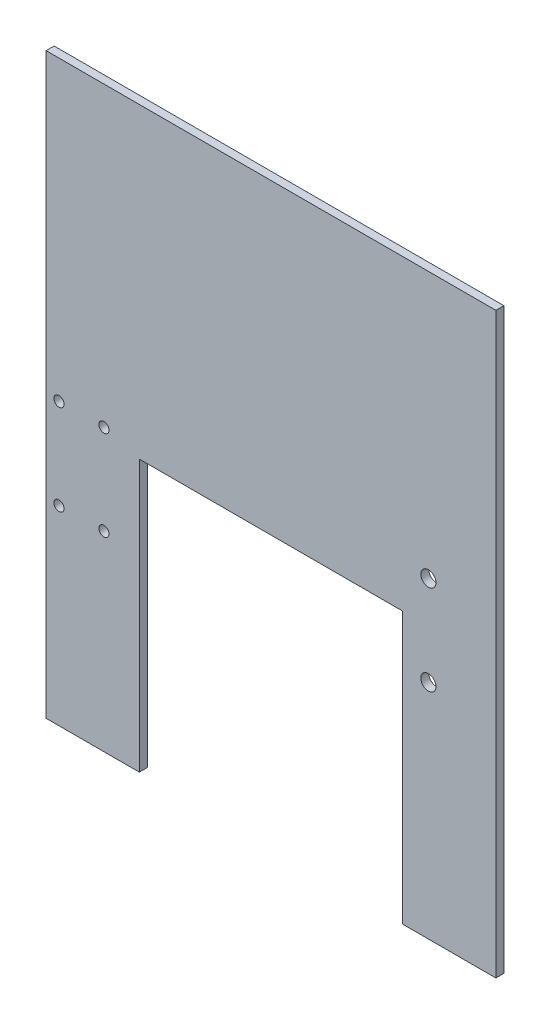
ISO-10303-21;
HEADER;
FILE_DESCRIPTION(('STEP AP214'),'2;1');
FILE_NAME('part.step','',(''),(''),'','','');
FILE_SCHEMA(('AUTOMOTIVE_DESIGN { 1 0 10303 214 1 1 1 1 }'));
ENDSEC;
DATA;
#1=APPLICATION_CONTEXT('core data for automotive mechanical design processes');
#2=APPLICATION_PROTOCOL_DEFINITION('international standard','automotive_design',2000,#1);
#3=PRODUCT_CONTEXT('',#1,'mechanical');
#4=PRODUCT('Part','Part','',(#3));
#5=PRODUCT_RELATED_PRODUCT_CATEGORY('part','',(#4));
#6=PRODUCT_DEFINITION_FORMATION('','',#4);
#7=PRODUCT_DEFINITION_CONTEXT('part definition',#1,'design');
#8=PRODUCT_DEFINITION('design','',#6,#7);
#9=PRODUCT_DEFINITION_SHAPE('','',#8);
#10=(LENGTH_UNIT() NAMED_UNIT(*) SI_UNIT(.MILLI.,.METRE.));
#11=(NAMED_UNIT(*) PLANE_ANGLE_UNIT() SI_UNIT($,.RADIAN.));
#12=(NAMED_UNIT(*) SI_UNIT($,.STERADIAN.) SOLID_ANGLE_UNIT());
#13=UNCERTAINTY_MEASURE_WITH_UNIT(LENGTH_MEASURE(1.E-05),#10,'distance_accuracy_value','');
#14=(GEOMETRIC_REPRESENTATION_CONTEXT(3) GLOBAL_UNCERTAINTY_ASSIGNED_CONTEXT((#13)) GLOBAL_UNIT_ASSIGNED_CONTEXT((#10,
#11,#12)) REPRESENTATION_CONTEXT('',''));
#15=CARTESIAN_POINT('',(0.,0.,0.));
#16=DIRECTION('',(0.,0.,1.));
#17=DIRECTION('',(1.,0.,0.));
#18=AXIS2_PLACEMENT_3D('',#15,#16,#17);
#19=CARTESIAN_POINT('',(36.83,0.,3.175));
#20=DIRECTION('',(0.,1.,0.));
#21=DIRECTION('',(-1.,0.,0.));
#22=AXIS2_PLACEMENT_3D('',#19,#20,#21);
#23=PLANE('',#22);
#24=DIRECTION('',(1.,0.,0.));
#25=VECTOR('',#24,1.);
#26=CARTESIAN_POINT('',(36.83,0.,0.));
#27=LINE('',#26,#25);
#28=CARTESIAN_POINT('',(0.,0.,0.));
#29=VERTEX_POINT('',#28);
#30=CARTESIAN_POINT('',(36.83,0.,0.));
#31=VERTEX_POINT('',#30);
#32=EDGE_CURVE('E149',#29,#31,#27,.T.);
#33=ORIENTED_EDGE('',*,*,#32,.T.);
#34=DIRECTION('',(0.,0.,-1.));
#35=VECTOR('',#34,1.);
#36=CARTESIAN_POINT('',(36.83,0.,3.175));
#37=LINE('',#36,#35);
#38=CARTESIAN_POINT('',(36.83,0.,3.175));
#39=VERTEX_POINT('',#38);
#40=EDGE_CURVE('E12',#39,#31,#37,.T.);
#41=ORIENTED_EDGE('',*,*,#40,.F.);
#42=DIRECTION('',(1.,0.,0.));
#43=VECTOR('',#42,1.);
#44=CARTESIAN_POINT('',(36.83,0.,3.175));
#45=LINE('',#44,#43);
#46=CARTESIAN_POINT('',(0.,0.,3.175));
#47=VERTEX_POINT('',#46);
#48=EDGE_CURVE('E164',#47,#39,#45,.T.);
#49=ORIENTED_EDGE('',*,*,#48,.F.);
#50=DIRECTION('',(0.,0.,-1.));
#51=VECTOR('',#50,1.);
#52=CARTESIAN_POINT('',(0.,0.,3.175));
#53=LINE('',#52,#51);
#54=EDGE_CURVE('E145',#47,#29,#53,.T.);
#55=ORIENTED_EDGE('',*,*,#54,.T.);
#56=EDGE_LOOP('',(#33,#41,#49,#55));
#57=FACE_BOUND('',#56,.T.);
#58=ADVANCED_FACE('F53',(#57),#23,.F.);
#59=CARTESIAN_POINT('',(36.83,107.188,3.175));
#60=DIRECTION('',(-1.,0.,0.));
#61=DIRECTION('',(0.,-1.,0.));
#62=AXIS2_PLACEMENT_3D('',#59,#60,#61);
#63=PLANE('',#62);
#64=DIRECTION('',(0.,1.,0.));
#65=VECTOR('',#64,1.);
#66=CARTESIAN_POINT('',(36.83,107.188,0.));
#67=LINE('',#66,#65);
#68=CARTESIAN_POINT('',(36.83,107.188,0.));
#69=VERTEX_POINT('',#68);
#70=EDGE_CURVE('E152',#31,#69,#67,.T.);
#71=ORIENTED_EDGE('',*,*,#70,.T.);
#72=DIRECTION('',(0.,0.,-1.));
#73=VECTOR('',#72,1.);
#74=CARTESIAN_POINT('',(36.83,107.188,3.175));
#75=LINE('',#74,#73);
#76=CARTESIAN_POINT('',(36.83,107.188,3.175));
#77=VERTEX_POINT('',#76);
#78=EDGE_CURVE('E61',#77,#69,#75,.T.);
#79=ORIENTED_EDGE('',*,*,#78,.F.);
#80=DIRECTION('',(0.,1.,0.));
#81=VECTOR('',#80,1.);
#82=CARTESIAN_POINT('',(36.83,107.188,3.175));
#83=LINE('',#82,#81);
#84=EDGE_CURVE('E112',#39,#77,#83,.T.);
#85=ORIENTED_EDGE('',*,*,#84,.F.);
#86=ORIENTED_EDGE('',*,*,#40,.T.);
#87=EDGE_LOOP('',(#71,#79,#85,#86));
#88=FACE_BOUND('',#87,.T.);
#89=ADVANCED_FACE('F265',(#88),#63,.F.);
#90=CARTESIAN_POINT('',(140.97,107.188,3.175));
#91=DIRECTION('',(0.,1.,0.));
#92=DIRECTION('',(-1.,0.,0.));
#93=AXIS2_PLACEMENT_3D('',#90,#91,#92);
#94=PLANE('',#93);
#95=DIRECTION('',(1.,0.,0.));
#96=VECTOR('',#95,1.);
#97=CARTESIAN_POINT('',(140.97,107.188,0.));
#98=LINE('',#97,#96);
#99=CARTESIAN_POINT('',(140.97,107.188,0.));
#100=VERTEX_POINT('',#99);
#101=EDGE_CURVE('E155',#69,#100,#98,.T.);
#102=ORIENTED_EDGE('',*,*,#101,.T.);
#103=DIRECTION('',(0.,0.,-1.));
#104=VECTOR('',#103,1.);
#105=CARTESIAN_POINT('',(140.97,107.188,3.175));
#106=LINE('',#105,#104);
#107=CARTESIAN_POINT('',(140.97,107.188,3.175));
#108=VERTEX_POINT('',#107);
#109=EDGE_CURVE('E171',#108,#100,#106,.T.);
#110=ORIENTED_EDGE('',*,*,#109,.F.);
#111=DIRECTION('',(1.,0.,0.));
#112=VECTOR('',#111,1.);
#113=CARTESIAN_POINT('',(140.97,107.188,3.175));
#114=LINE('',#113,#112);
#115=EDGE_CURVE('E179',#77,#108,#114,.T.);
#116=ORIENTED_EDGE('',*,*,#115,.F.);
#117=ORIENTED_EDGE('',*,*,#78,.T.);
#118=EDGE_LOOP('',(#102,#110,#116,#117));
#119=FACE_BOUND('',#118,.T.);
#120=ADVANCED_FACE('F177',(#119),#94,.F.);
#121=CARTESIAN_POINT('',(140.97,0.,3.175));
#122=DIRECTION('',(1.,0.,0.));
#123=DIRECTION('',(0.,0.,-1.));
#124=AXIS2_PLACEMENT_3D('',#121,#122,#123);
#125=PLANE('',#124);
#126=DIRECTION('',(0.,-1.,0.));
#127=VECTOR('',#126,1.);
#128=CARTESIAN_POINT('',(140.97,0.,0.));
#129=LINE('',#128,#127);
#130=CARTESIAN_POINT('',(140.97,0.,0.));
#131=VERTEX_POINT('',#130);
#132=EDGE_CURVE('E157',#100,#131,#129,.T.);
#133=ORIENTED_EDGE('',*,*,#132,.T.);
#134=DIRECTION('',(0.,0.,-1.));
#135=VECTOR('',#134,1.);
#136=CARTESIAN_POINT('',(140.97,0.,3.175));
#137=LINE('',#136,#135);
#138=CARTESIAN_POINT('',(140.97,0.,3.175));
#139=VERTEX_POINT('',#138);
#140=EDGE_CURVE('E168',#139,#131,#137,.T.);
#141=ORIENTED_EDGE('',*,*,#140,.F.);
#142=DIRECTION('',(0.,-1.,0.));
#143=VECTOR('',#142,1.);
#144=CARTESIAN_POINT('',(140.97,0.,3.175));
#145=LINE('',#144,#143);
#146=EDGE_CURVE('E191',#108,#139,#145,.T.);
#147=ORIENTED_EDGE('',*,*,#146,.F.);
#148=ORIENTED_EDGE('',*,*,#109,.T.);
#149=EDGE_LOOP('',(#133,#141,#147,#148));
#150=FACE_BOUND('',#149,.T.);
#151=ADVANCED_FACE('F187',(#150),#125,.F.);
#152=CARTESIAN_POINT('',(177.8,0.,3.175));
#153=DIRECTION('',(0.,1.,0.));
#154=DIRECTION('',(-1.,0.,0.));
#155=AXIS2_PLACEMENT_3D('',#152,#153,#154);
#156=PLANE('',#155);
#157=DIRECTION('',(1.,0.,0.));
#158=VECTOR('',#157,1.);
#159=CARTESIAN_POINT('',(177.8,0.,0.));
#160=LINE('',#159,#158);
#161=CARTESIAN_POINT('',(177.8,0.,0.));
#162=VERTEX_POINT('',#161);
#163=EDGE_CURVE('E159',#131,#162,#160,.T.);
#164=ORIENTED_EDGE('',*,*,#163,.T.);
#165=DIRECTION('',(0.,0.,-1.));
#166=VECTOR('',#165,1.);
#167=CARTESIAN_POINT('',(177.8,0.,3.175));
#168=LINE('',#167,#166);
#169=CARTESIAN_POINT('',(177.8,0.,3.175));
#170=VERTEX_POINT('',#169);
#171=EDGE_CURVE('E140',#170,#162,#168,.T.);
#172=ORIENTED_EDGE('',*,*,#171,.F.);
#173=DIRECTION('',(1.,0.,0.));
#174=VECTOR('',#173,1.);
#175=CARTESIAN_POINT('',(177.8,0.,3.175));
#176=LINE('',#175,#174);
#177=EDGE_CURVE('E131',#139,#170,#176,.T.);
#178=ORIENTED_EDGE('',*,*,#177,.F.);
#179=ORIENTED_EDGE('',*,*,#140,.T.);
#180=EDGE_LOOP('',(#164,#172,#178,#179));
#181=FACE_BOUND('',#180,.T.);
#182=ADVANCED_FACE('F190',(#181),#156,.F.);
#183=CARTESIAN_POINT('',(177.8,228.6,3.175));
#184=DIRECTION('',(-1.,0.,0.));
#185=DIRECTION('',(0.,-1.,0.));
#186=AXIS2_PLACEMENT_3D('',#183,#184,#185);
#187=PLANE('',#186);
#188=DIRECTION('',(0.,1.,0.));
#189=VECTOR('',#188,1.);
#190=CARTESIAN_POINT('',(177.8,228.6,0.));
#191=LINE('',#190,#189);
#192=CARTESIAN_POINT('',(177.8,228.6,0.));
#193=VERTEX_POINT('',#192);
#194=EDGE_CURVE('E139',#162,#193,#191,.T.);
#195=ORIENTED_EDGE('',*,*,#194,.T.);
#196=DIRECTION('',(0.,0.,-1.));
#197=VECTOR('',#196,1.);
#198=CARTESIAN_POINT('',(177.8,228.6,3.175));
#199=LINE('',#198,#197);
#200=CARTESIAN_POINT('',(177.8,228.6,3.175));
#201=VERTEX_POINT('',#200);
#202=EDGE_CURVE('E136',#201,#193,#199,.T.);
#203=ORIENTED_EDGE('',*,*,#202,.F.);
#204=DIRECTION('',(0.,1.,0.));
#205=VECTOR('',#204,1.);
#206=CARTESIAN_POINT('',(177.8,228.6,3.175));
#207=LINE('',#206,#205);
#208=EDGE_CURVE('E125',#170,#201,#207,.T.);
#209=ORIENTED_EDGE('',*,*,#208,.F.);
#210=ORIENTED_EDGE('',*,*,#171,.T.);
#211=EDGE_LOOP('',(#195,#203,#209,#210));
#212=FACE_BOUND('',#211,.T.);
#213=ADVANCED_FACE('F137',(#212),#187,.F.);
#214=CARTESIAN_POINT('',(0.,228.6,3.175));
#215=DIRECTION('',(0.,-1.,0.));
#216=DIRECTION('',(1.,0.,0.));
#217=AXIS2_PLACEMENT_3D('',#214,#215,#216);
#218=PLANE('',#217);
#219=DIRECTION('',(-1.,0.,0.));
#220=VECTOR('',#219,1.);
#221=CARTESIAN_POINT('',(0.,228.6,0.));
#222=LINE('',#221,#220);
#223=CARTESIAN_POINT('',(0.,228.6,0.));
#224=VERTEX_POINT('',#223);
#225=EDGE_CURVE('E98',#193,#224,#222,.T.);
#226=ORIENTED_EDGE('',*,*,#225,.T.);
#227=DIRECTION('',(0.,0.,-1.));
#228=VECTOR('',#227,1.);
#229=CARTESIAN_POINT('',(0.,228.6,3.175));
#230=LINE('',#229,#228);
#231=CARTESIAN_POINT('',(0.,228.6,3.175));
#232=VERTEX_POINT('',#231);
#233=EDGE_CURVE('E141',#232,#224,#230,.T.);
#234=ORIENTED_EDGE('',*,*,#233,.F.);
#235=DIRECTION('',(-1.,0.,0.));
#236=VECTOR('',#235,1.);
#237=CARTESIAN_POINT('',(0.,228.6,3.175));
#238=LINE('',#237,#236);
#239=EDGE_CURVE('E129',#201,#232,#238,.T.);
#240=ORIENTED_EDGE('',*,*,#239,.F.);
#241=ORIENTED_EDGE('',*,*,#202,.T.);
#242=EDGE_LOOP('',(#226,#234,#240,#241));
#243=FACE_BOUND('',#242,.T.);
#244=ADVANCED_FACE('F143',(#243),#218,.F.);
#245=CARTESIAN_POINT('',(0.,0.,3.175));
#246=DIRECTION('',(1.,0.,0.));
#247=DIRECTION('',(0.,1.,0.));
#248=AXIS2_PLACEMENT_3D('',#245,#246,#247);
#249=PLANE('',#248);
#250=DIRECTION('',(0.,-1.,0.));
#251=VECTOR('',#250,1.);
#252=CARTESIAN_POINT('',(0.,0.,0.));
#253=LINE('',#252,#251);
#254=EDGE_CURVE('E104',#224,#29,#253,.T.);
#255=ORIENTED_EDGE('',*,*,#254,.T.);
#256=ORIENTED_EDGE('',*,*,#54,.F.);
#257=DIRECTION('',(0.,-1.,0.));
#258=VECTOR('',#257,1.);
#259=CARTESIAN_POINT('',(0.,0.,3.175));
#260=LINE('',#259,#258);
#261=EDGE_CURVE('E69',#232,#47,#260,.T.);
#262=ORIENTED_EDGE('',*,*,#261,.F.);
#263=ORIENTED_EDGE('',*,*,#233,.T.);
#264=EDGE_LOOP('',(#255,#256,#262,#263));
#265=FACE_BOUND('',#264,.T.);
#266=ADVANCED_FACE('F272',(#265),#249,.F.);
#267=CARTESIAN_POINT('',(0.,0.,3.175));
#268=DIRECTION('',(0.,0.,-1.));
#269=DIRECTION('',(-1.,0.,0.));
#270=AXIS2_PLACEMENT_3D('',#267,#268,#269);
#271=PLANE('',#270);
#272=CARTESIAN_POINT('',(151.122459790118,123.444,3.175));
#273=DIRECTION('',(0.,0.,-1.));
#274=DIRECTION('',(-1.,0.,0.));
#275=AXIS2_PLACEMENT_3D('',#272,#273,#274);
#276=CIRCLE('',#275,2.99999999999999);
#277=CARTESIAN_POINT('',(148.122459790118,123.444,3.175));
#278=VERTEX_POINT('',#277);
#279=EDGE_CURVE('E218',#278,#278,#276,.T.);
#280=ORIENTED_EDGE('',*,*,#279,.T.);
#281=EDGE_LOOP('',(#280));
#282=FACE_BOUND('',#281,.T.);
#283=CARTESIAN_POINT('',(151.122459790118,87.884,3.175));
#284=DIRECTION('',(0.,0.,-1.));
#285=DIRECTION('',(-1.,0.,0.));
#286=AXIS2_PLACEMENT_3D('',#283,#284,#285);
#287=CIRCLE('',#286,2.99999999999999);
#288=CARTESIAN_POINT('',(148.122459790118,87.884,3.175));
#289=VERTEX_POINT('',#288);
#290=EDGE_CURVE('E223',#289,#289,#287,.T.);
#291=ORIENTED_EDGE('',*,*,#290,.T.);
#292=EDGE_LOOP('',(#291));
#293=FACE_BOUND('',#292,.T.);
#294=CARTESIAN_POINT('',(22.86,111.071616711567,3.175));
#295=DIRECTION('',(0.,0.,-1.));
#296=DIRECTION('',(-1.,0.,0.));
#297=AXIS2_PLACEMENT_3D('',#294,#295,#296);
#298=CIRCLE('',#297,2.);
#299=CARTESIAN_POINT('',(20.86,111.071616711567,3.175));
#300=VERTEX_POINT('',#299);
#301=EDGE_CURVE('E210',#300,#300,#298,.T.);
#302=ORIENTED_EDGE('',*,*,#301,.T.);
#303=EDGE_LOOP('',(#302));
#304=FACE_BOUND('',#303,.T.);
#305=CARTESIAN_POINT('',(5.0808864246614,75.334076645071,3.175));
#306=DIRECTION('',(0.,0.,-1.));
#307=DIRECTION('',(-1.,0.,0.));
#308=AXIS2_PLACEMENT_3D('',#305,#306,#307);
#309=CIRCLE('',#308,2.00000000000001);
#310=CARTESIAN_POINT('',(3.08088642466139,75.334076645071,3.175));
#311=VERTEX_POINT('',#310);
#312=EDGE_CURVE('E203',#311,#311,#309,.T.);
#313=ORIENTED_EDGE('',*,*,#312,.T.);
#314=EDGE_LOOP('',(#313));
#315=FACE_BOUND('',#314,.T.);
#316=CARTESIAN_POINT('',(5.08088642466141,111.071616711567,3.175));
#317=DIRECTION('',(0.,0.,-1.));
#318=DIRECTION('',(-1.,0.,0.));
#319=AXIS2_PLACEMENT_3D('',#316,#317,#318);
#320=CIRCLE('',#319,2.00000000000001);
#321=CARTESIAN_POINT('',(3.0808864246614,111.071616711567,3.175));
#322=VERTEX_POINT('',#321);
#323=EDGE_CURVE('E215',#322,#322,#320,.T.);
#324=ORIENTED_EDGE('',*,*,#323,.T.);
#325=EDGE_LOOP('',(#324));
#326=FACE_BOUND('',#325,.T.);
#327=CARTESIAN_POINT('',(22.86,75.511616711567,3.175));
#328=DIRECTION('',(0.,0.,-1.));
#329=DIRECTION('',(-1.,0.,0.));
#330=AXIS2_PLACEMENT_3D('',#327,#328,#329);
#331=CIRCLE('',#330,2.00000000000001);
#332=CARTESIAN_POINT('',(20.86,75.511616711567,3.175));
#333=VERTEX_POINT('',#332);
#334=EDGE_CURVE('E153',#333,#333,#331,.T.);
#335=ORIENTED_EDGE('',*,*,#334,.T.);
#336=EDGE_LOOP('',(#335));
#337=FACE_BOUND('',#336,.T.);
#338=ORIENTED_EDGE('',*,*,#48,.T.);
#339=ORIENTED_EDGE('',*,*,#84,.T.);
#340=ORIENTED_EDGE('',*,*,#115,.T.);
#341=ORIENTED_EDGE('',*,*,#146,.T.);
#342=ORIENTED_EDGE('',*,*,#177,.T.);
#343=ORIENTED_EDGE('',*,*,#208,.T.);
#344=ORIENTED_EDGE('',*,*,#239,.T.);
#345=ORIENTED_EDGE('',*,*,#261,.T.);
#346=EDGE_LOOP('',(#338,#339,#340,#341,#342,#343,#344,#345));
#347=FACE_BOUND('',#346,.T.);
#348=ADVANCED_FACE('F127',(#282,#293,#304,#315,#326,#337,#347),#271,.F.);
#349=CARTESIAN_POINT('',(0.,0.,0.));
#350=DIRECTION('',(0.,0.,-1.));
#351=DIRECTION('',(-1.,0.,0.));
#352=AXIS2_PLACEMENT_3D('',#349,#350,#351);
#353=PLANE('',#352);
#354=CARTESIAN_POINT('',(151.122459790118,123.444,0.));
#355=DIRECTION('',(0.,0.,-1.));
#356=DIRECTION('',(-1.,0.,0.));
#357=AXIS2_PLACEMENT_3D('',#354,#355,#356);
#358=CIRCLE('',#357,2.99999999999999);
#359=CARTESIAN_POINT('',(148.122459790118,123.444,0.));
#360=VERTEX_POINT('',#359);
#361=EDGE_CURVE('E226',#360,#360,#358,.T.);
#362=ORIENTED_EDGE('',*,*,#361,.F.);
#363=EDGE_LOOP('',(#362));
#364=FACE_BOUND('',#363,.T.);
#365=CARTESIAN_POINT('',(151.122459790118,87.884,0.));
#366=DIRECTION('',(0.,0.,-1.));
#367=DIRECTION('',(-1.,0.,0.));
#368=AXIS2_PLACEMENT_3D('',#365,#366,#367);
#369=CIRCLE('',#368,2.99999999999999);
#370=CARTESIAN_POINT('',(148.122459790118,87.884,0.));
#371=VERTEX_POINT('',#370);
#372=EDGE_CURVE('E227',#371,#371,#369,.T.);
#373=ORIENTED_EDGE('',*,*,#372,.F.);
#374=EDGE_LOOP('',(#373));
#375=FACE_BOUND('',#374,.T.);
#376=CARTESIAN_POINT('',(22.86,111.071616711567,0.));
#377=DIRECTION('',(0.,0.,-1.));
#378=DIRECTION('',(-1.,0.,0.));
#379=AXIS2_PLACEMENT_3D('',#376,#377,#378);
#380=CIRCLE('',#379,2.);
#381=CARTESIAN_POINT('',(20.86,111.071616711567,0.));
#382=VERTEX_POINT('',#381);
#383=EDGE_CURVE('E200',#382,#382,#380,.T.);
#384=ORIENTED_EDGE('',*,*,#383,.F.);
#385=EDGE_LOOP('',(#384));
#386=FACE_BOUND('',#385,.T.);
#387=CARTESIAN_POINT('',(5.0808864246614,75.334076645071,0.));
#388=DIRECTION('',(0.,0.,-1.));
#389=DIRECTION('',(-1.,0.,0.));
#390=AXIS2_PLACEMENT_3D('',#387,#388,#389);
#391=CIRCLE('',#390,2.00000000000001);
#392=CARTESIAN_POINT('',(3.08088642466139,75.334076645071,0.));
#393=VERTEX_POINT('',#392);
#394=EDGE_CURVE('E206',#393,#393,#391,.T.);
#395=ORIENTED_EDGE('',*,*,#394,.F.);
#396=EDGE_LOOP('',(#395));
#397=FACE_BOUND('',#396,.T.);
#398=CARTESIAN_POINT('',(5.08088642466141,111.071616711567,0.));
#399=DIRECTION('',(0.,0.,-1.));
#400=DIRECTION('',(-1.,0.,0.));
#401=AXIS2_PLACEMENT_3D('',#398,#399,#400);
#402=CIRCLE('',#401,2.00000000000001);
#403=CARTESIAN_POINT('',(3.0808864246614,111.071616711567,0.));
#404=VERTEX_POINT('',#403);
#405=EDGE_CURVE('E207',#404,#404,#402,.T.);
#406=ORIENTED_EDGE('',*,*,#405,.F.);
#407=EDGE_LOOP('',(#406));
#408=FACE_BOUND('',#407,.T.);
#409=CARTESIAN_POINT('',(22.86,75.511616711567,0.));
#410=DIRECTION('',(0.,0.,-1.));
#411=DIRECTION('',(-1.,0.,0.));
#412=AXIS2_PLACEMENT_3D('',#409,#410,#411);
#413=CIRCLE('',#412,2.00000000000001);
#414=CARTESIAN_POINT('',(20.86,75.511616711567,0.));
#415=VERTEX_POINT('',#414);
#416=EDGE_CURVE('E197',#415,#415,#413,.T.);
#417=ORIENTED_EDGE('',*,*,#416,.F.);
#418=EDGE_LOOP('',(#417));
#419=FACE_BOUND('',#418,.T.);
#420=ORIENTED_EDGE('',*,*,#32,.F.);
#421=ORIENTED_EDGE('',*,*,#254,.F.);
#422=ORIENTED_EDGE('',*,*,#225,.F.);
#423=ORIENTED_EDGE('',*,*,#194,.F.);
#424=ORIENTED_EDGE('',*,*,#163,.F.);
#425=ORIENTED_EDGE('',*,*,#132,.F.);
#426=ORIENTED_EDGE('',*,*,#101,.F.);
#427=ORIENTED_EDGE('',*,*,#70,.F.);
#428=EDGE_LOOP('',(#420,#421,#422,#423,#424,#425,#426,#427));
#429=FACE_BOUND('',#428,.T.);
#430=ADVANCED_FACE('F183',(#364,#375,#386,#397,#408,#419,#429),#353,.T.);
#431=CARTESIAN_POINT('',(22.86,75.511616711567,3.175));
#432=DIRECTION('',(0.,0.,-1.));
#433=DIRECTION('',(-1.,0.,0.));
#434=AXIS2_PLACEMENT_3D('',#431,#432,#433);
#435=CYLINDRICAL_SURFACE('',#434,2.00000000000001);
#436=ORIENTED_EDGE('',*,*,#334,.F.);
#437=EDGE_LOOP('',(#436));
#438=FACE_BOUND('',#437,.T.);
#439=ORIENTED_EDGE('',*,*,#416,.T.);
#440=EDGE_LOOP('',(#439));
#441=FACE_BOUND('',#440,.T.);
#442=ADVANCED_FACE('F238',(#438,#441),#435,.F.);
#443=CARTESIAN_POINT('',(5.08088642466141,111.071616711567,3.175));
#444=DIRECTION('',(0.,0.,-1.));
#445=DIRECTION('',(-1.,0.,0.));
#446=AXIS2_PLACEMENT_3D('',#443,#444,#445);
#447=CYLINDRICAL_SURFACE('',#446,2.00000000000001);
#448=ORIENTED_EDGE('',*,*,#323,.F.);
#449=EDGE_LOOP('',(#448));
#450=FACE_BOUND('',#449,.T.);
#451=ORIENTED_EDGE('',*,*,#405,.T.);
#452=EDGE_LOOP('',(#451));
#453=FACE_BOUND('',#452,.T.);
#454=ADVANCED_FACE('F251',(#450,#453),#447,.F.);
#455=CARTESIAN_POINT('',(5.0808864246614,75.334076645071,3.175));
#456=DIRECTION('',(0.,0.,-1.));
#457=DIRECTION('',(-1.,0.,0.));
#458=AXIS2_PLACEMENT_3D('',#455,#456,#457);
#459=CYLINDRICAL_SURFACE('',#458,2.00000000000001);
#460=ORIENTED_EDGE('',*,*,#312,.F.);
#461=EDGE_LOOP('',(#460));
#462=FACE_BOUND('',#461,.T.);
#463=ORIENTED_EDGE('',*,*,#394,.T.);
#464=EDGE_LOOP('',(#463));
#465=FACE_BOUND('',#464,.T.);
#466=ADVANCED_FACE('F258',(#462,#465),#459,.F.);
#467=CARTESIAN_POINT('',(22.86,111.071616711567,3.175));
#468=DIRECTION('',(0.,0.,-1.));
#469=DIRECTION('',(-1.,0.,0.));
#470=AXIS2_PLACEMENT_3D('',#467,#468,#469);
#471=CYLINDRICAL_SURFACE('',#470,2.);
#472=ORIENTED_EDGE('',*,*,#301,.F.);
#473=EDGE_LOOP('',(#472));
#474=FACE_BOUND('',#473,.T.);
#475=ORIENTED_EDGE('',*,*,#383,.T.);
#476=EDGE_LOOP('',(#475));
#477=FACE_BOUND('',#476,.T.);
#478=ADVANCED_FACE('F353',(#474,#477),#471,.F.);
#479=CARTESIAN_POINT('',(151.122459790118,87.884,5.08));
#480=DIRECTION('',(0.,0.,-1.));
#481=DIRECTION('',(-1.,0.,0.));
#482=AXIS2_PLACEMENT_3D('',#479,#480,#481);
#483=CYLINDRICAL_SURFACE('',#482,2.99999999999999);
#484=ORIENTED_EDGE('',*,*,#372,.T.);
#485=EDGE_LOOP('',(#484));
#486=FACE_BOUND('',#485,.T.);
#487=ORIENTED_EDGE('',*,*,#290,.F.);
#488=EDGE_LOOP('',(#487));
#489=FACE_BOUND('',#488,.T.);
#490=ADVANCED_FACE('F361',(#486,#489),#483,.F.);
#491=CARTESIAN_POINT('',(151.122459790118,123.444,5.08));
#492=DIRECTION('',(0.,0.,-1.));
#493=DIRECTION('',(-1.,0.,0.));
#494=AXIS2_PLACEMENT_3D('',#491,#492,#493);
#495=CYLINDRICAL_SURFACE('',#494,2.99999999999999);
#496=ORIENTED_EDGE('',*,*,#361,.T.);
#497=EDGE_LOOP('',(#496));
#498=FACE_BOUND('',#497,.T.);
#499=ORIENTED_EDGE('',*,*,#279,.F.);
#500=EDGE_LOOP('',(#499));
#501=FACE_BOUND('',#500,.T.);
#502=ADVANCED_FACE('F233',(#498,#501),#495,.F.);
#503=CLOSED_SHELL('',(#58,#89,#120,#151,#182,#213,#244,#266,#348,#430,#442,#454,#466,#478,#490,#502));
#504=MANIFOLD_SOLID_BREP('B2',#503);
#505=ADVANCED_BREP_SHAPE_REPRESENTATION('',(#18,#504),#14);
#506=SHAPE_DEFINITION_REPRESENTATION(#9,#505);
ENDSEC;
END-ISO-10303-21;
